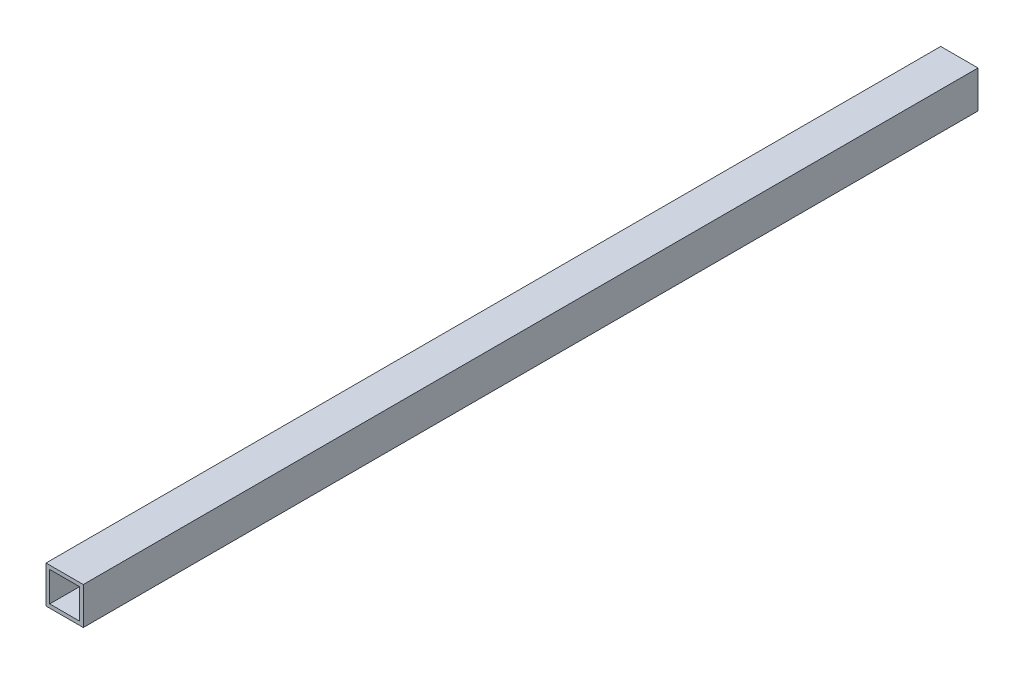
ISO-10303-21;
HEADER;
FILE_DESCRIPTION(('STEP AP214'),'2;1');
FILE_NAME('part.step','',(''),(''),'','','');
FILE_SCHEMA(('AUTOMOTIVE_DESIGN { 1 0 10303 214 1 1 1 1 }'));
ENDSEC;
DATA;
#1=APPLICATION_CONTEXT('core data for automotive mechanical design processes');
#2=APPLICATION_PROTOCOL_DEFINITION('international standard','automotive_design',2000,#1);
#3=PRODUCT_CONTEXT('',#1,'mechanical');
#4=PRODUCT('Part','Part','',(#3));
#5=PRODUCT_RELATED_PRODUCT_CATEGORY('part','',(#4));
#6=PRODUCT_DEFINITION_FORMATION('','',#4);
#7=PRODUCT_DEFINITION_CONTEXT('part definition',#1,'design');
#8=PRODUCT_DEFINITION('design','',#6,#7);
#9=PRODUCT_DEFINITION_SHAPE('','',#8);
#10=(LENGTH_UNIT() NAMED_UNIT(*) SI_UNIT(.MILLI.,.METRE.));
#11=(NAMED_UNIT(*) PLANE_ANGLE_UNIT() SI_UNIT($,.RADIAN.));
#12=(NAMED_UNIT(*) SI_UNIT($,.STERADIAN.) SOLID_ANGLE_UNIT());
#13=UNCERTAINTY_MEASURE_WITH_UNIT(LENGTH_MEASURE(1.E-05),#10,'distance_accuracy_value','');
#14=(GEOMETRIC_REPRESENTATION_CONTEXT(3) GLOBAL_UNCERTAINTY_ASSIGNED_CONTEXT((#13)) GLOBAL_UNIT_ASSIGNED_CONTEXT((#10,
#11,#12)) REPRESENTATION_CONTEXT('',''));
#15=CARTESIAN_POINT('',(0.,0.,0.));
#16=DIRECTION('',(0.,0.,1.));
#17=DIRECTION('',(1.,0.,0.));
#18=AXIS2_PLACEMENT_3D('',#15,#16,#17);
#19=CARTESIAN_POINT('',(0.,0.,480.));
#20=DIRECTION('',(0.,0.,1.));
#21=DIRECTION('',(1.,0.,0.));
#22=AXIS2_PLACEMENT_3D('',#19,#20,#21);
#23=PLANE('',#22);
#24=DIRECTION('',(0.,1.,0.));
#25=VECTOR('',#24,1.);
#26=CARTESIAN_POINT('',(10.,10.,480.));
#27=LINE('',#26,#25);
#28=CARTESIAN_POINT('',(10.,-9.99999999999999,480.));
#29=VERTEX_POINT('',#28);
#30=CARTESIAN_POINT('',(10.,10.,480.));
#31=VERTEX_POINT('',#30);
#32=EDGE_CURVE('E142',#29,#31,#27,.T.);
#33=ORIENTED_EDGE('',*,*,#32,.T.);
#34=DIRECTION('',(-1.,0.,0.));
#35=VECTOR('',#34,1.);
#36=CARTESIAN_POINT('',(-10.,10.,480.));
#37=LINE('',#36,#35);
#38=CARTESIAN_POINT('',(-10.,10.,480.));
#39=VERTEX_POINT('',#38);
#40=EDGE_CURVE('E145',#31,#39,#37,.T.);
#41=ORIENTED_EDGE('',*,*,#40,.T.);
#42=DIRECTION('',(0.,-1.,0.));
#43=VECTOR('',#42,1.);
#44=CARTESIAN_POINT('',(-10.,10.,480.));
#45=LINE('',#44,#43);
#46=CARTESIAN_POINT('',(-10.,-10.,480.));
#47=VERTEX_POINT('',#46);
#48=EDGE_CURVE('E148',#39,#47,#45,.T.);
#49=ORIENTED_EDGE('',*,*,#48,.T.);
#50=DIRECTION('',(1.,0.,0.));
#51=VECTOR('',#50,1.);
#52=CARTESIAN_POINT('',(-10.,-10.,480.));
#53=LINE('',#52,#51);
#54=EDGE_CURVE('E150',#47,#29,#53,.T.);
#55=ORIENTED_EDGE('',*,*,#54,.T.);
#56=EDGE_LOOP('',(#33,#41,#49,#55));
#57=FACE_BOUND('',#56,.T.);
#58=DIRECTION('',(-1.,0.,0.));
#59=VECTOR('',#58,1.);
#60=CARTESIAN_POINT('',(-8.,8.,480.));
#61=LINE('',#60,#59);
#62=CARTESIAN_POINT('',(8.,8.,480.));
#63=VERTEX_POINT('',#62);
#64=CARTESIAN_POINT('',(-8.,8.,480.));
#65=VERTEX_POINT('',#64);
#66=EDGE_CURVE('E114',#63,#65,#61,.T.);
#67=ORIENTED_EDGE('',*,*,#66,.F.);
#68=DIRECTION('',(0.,1.,0.));
#69=VECTOR('',#68,1.);
#70=CARTESIAN_POINT('',(8.,-8.,480.));
#71=LINE('',#70,#69);
#72=CARTESIAN_POINT('',(8.,-8.,480.));
#73=VERTEX_POINT('',#72);
#74=EDGE_CURVE('E106',#73,#63,#71,.T.);
#75=ORIENTED_EDGE('',*,*,#74,.F.);
#76=DIRECTION('',(1.,0.,0.));
#77=VECTOR('',#76,1.);
#78=CARTESIAN_POINT('',(-8.,-8.,480.));
#79=LINE('',#78,#77);
#80=CARTESIAN_POINT('',(-8.,-8.,480.));
#81=VERTEX_POINT('',#80);
#82=EDGE_CURVE('E128',#81,#73,#79,.T.);
#83=ORIENTED_EDGE('',*,*,#82,.F.);
#84=DIRECTION('',(0.,-1.,0.));
#85=VECTOR('',#84,1.);
#86=CARTESIAN_POINT('',(-8.,-8.,480.));
#87=LINE('',#86,#85);
#88=EDGE_CURVE('E126',#65,#81,#87,.T.);
#89=ORIENTED_EDGE('',*,*,#88,.F.);
#90=EDGE_LOOP('',(#67,#75,#83,#89));
#91=FACE_BOUND('',#90,.T.);
#92=ADVANCED_FACE('F41',(#57,#91),#23,.T.);
#93=CARTESIAN_POINT('',(0.,0.,0.));
#94=DIRECTION('',(0.,0.,1.));
#95=DIRECTION('',(1.,0.,0.));
#96=AXIS2_PLACEMENT_3D('',#93,#94,#95);
#97=PLANE('',#96);
#98=DIRECTION('',(0.,1.,0.));
#99=VECTOR('',#98,1.);
#100=CARTESIAN_POINT('',(10.,10.,0.));
#101=LINE('',#100,#99);
#102=CARTESIAN_POINT('',(10.,-9.99999999999999,0.));
#103=VERTEX_POINT('',#102);
#104=CARTESIAN_POINT('',(10.,10.,0.));
#105=VERTEX_POINT('',#104);
#106=EDGE_CURVE('E122',#103,#105,#101,.T.);
#107=ORIENTED_EDGE('',*,*,#106,.F.);
#108=DIRECTION('',(1.,0.,0.));
#109=VECTOR('',#108,1.);
#110=CARTESIAN_POINT('',(-10.,-10.,0.));
#111=LINE('',#110,#109);
#112=CARTESIAN_POINT('',(-10.,-10.,0.));
#113=VERTEX_POINT('',#112);
#114=EDGE_CURVE('E146',#113,#103,#111,.T.);
#115=ORIENTED_EDGE('',*,*,#114,.F.);
#116=DIRECTION('',(0.,-1.,0.));
#117=VECTOR('',#116,1.);
#118=CARTESIAN_POINT('',(-10.,10.,0.));
#119=LINE('',#118,#117);
#120=CARTESIAN_POINT('',(-10.,10.,0.));
#121=VERTEX_POINT('',#120);
#122=EDGE_CURVE('E157',#121,#113,#119,.T.);
#123=ORIENTED_EDGE('',*,*,#122,.F.);
#124=DIRECTION('',(-1.,0.,0.));
#125=VECTOR('',#124,1.);
#126=CARTESIAN_POINT('',(-10.,10.,0.));
#127=LINE('',#126,#125);
#128=EDGE_CURVE('E155',#105,#121,#127,.T.);
#129=ORIENTED_EDGE('',*,*,#128,.F.);
#130=EDGE_LOOP('',(#107,#115,#123,#129));
#131=FACE_BOUND('',#130,.T.);
#132=DIRECTION('',(0.,1.,0.));
#133=VECTOR('',#132,1.);
#134=CARTESIAN_POINT('',(8.,-8.,0.));
#135=LINE('',#134,#133);
#136=CARTESIAN_POINT('',(8.,-8.,0.));
#137=VERTEX_POINT('',#136);
#138=CARTESIAN_POINT('',(8.,8.,0.));
#139=VERTEX_POINT('',#138);
#140=EDGE_CURVE('E64',#137,#139,#135,.T.);
#141=ORIENTED_EDGE('',*,*,#140,.T.);
#142=DIRECTION('',(-1.,0.,0.));
#143=VECTOR('',#142,1.);
#144=CARTESIAN_POINT('',(-8.,8.,0.));
#145=LINE('',#144,#143);
#146=CARTESIAN_POINT('',(-8.,8.,0.));
#147=VERTEX_POINT('',#146);
#148=EDGE_CURVE('E121',#139,#147,#145,.T.);
#149=ORIENTED_EDGE('',*,*,#148,.T.);
#150=DIRECTION('',(0.,-1.,0.));
#151=VECTOR('',#150,1.);
#152=CARTESIAN_POINT('',(-8.,-8.,0.));
#153=LINE('',#152,#151);
#154=CARTESIAN_POINT('',(-8.,-8.,0.));
#155=VERTEX_POINT('',#154);
#156=EDGE_CURVE('E134',#147,#155,#153,.T.);
#157=ORIENTED_EDGE('',*,*,#156,.T.);
#158=DIRECTION('',(1.,0.,0.));
#159=VECTOR('',#158,1.);
#160=CARTESIAN_POINT('',(-8.,-8.,0.));
#161=LINE('',#160,#159);
#162=EDGE_CURVE('E115',#155,#137,#161,.T.);
#163=ORIENTED_EDGE('',*,*,#162,.T.);
#164=EDGE_LOOP('',(#141,#149,#157,#163));
#165=FACE_BOUND('',#164,.T.);
#166=ADVANCED_FACE('F175',(#131,#165),#97,.F.);
#167=CARTESIAN_POINT('',(10.,10.,480.));
#168=DIRECTION('',(-1.,0.,0.));
#169=DIRECTION('',(0.,-1.,0.));
#170=AXIS2_PLACEMENT_3D('',#167,#168,#169);
#171=PLANE('',#170);
#172=ORIENTED_EDGE('',*,*,#106,.T.);
#173=DIRECTION('',(0.,0.,-1.));
#174=VECTOR('',#173,1.);
#175=CARTESIAN_POINT('',(10.,10.,480.));
#176=LINE('',#175,#174);
#177=EDGE_CURVE('E11',#31,#105,#176,.T.);
#178=ORIENTED_EDGE('',*,*,#177,.F.);
#179=ORIENTED_EDGE('',*,*,#32,.F.);
#180=DIRECTION('',(0.,0.,-1.));
#181=VECTOR('',#180,1.);
#182=CARTESIAN_POINT('',(10.,-9.99999999999999,480.));
#183=LINE('',#182,#181);
#184=EDGE_CURVE('E152',#29,#103,#183,.T.);
#185=ORIENTED_EDGE('',*,*,#184,.T.);
#186=EDGE_LOOP('',(#172,#178,#179,#185));
#187=FACE_BOUND('',#186,.T.);
#188=ADVANCED_FACE('F43',(#187),#171,.F.);
#189=CARTESIAN_POINT('',(-10.,10.,480.));
#190=DIRECTION('',(0.,-1.,0.));
#191=DIRECTION('',(0.,0.,-1.));
#192=AXIS2_PLACEMENT_3D('',#189,#190,#191);
#193=PLANE('',#192);
#194=ORIENTED_EDGE('',*,*,#128,.T.);
#195=DIRECTION('',(0.,0.,-1.));
#196=VECTOR('',#195,1.);
#197=CARTESIAN_POINT('',(-10.,10.,480.));
#198=LINE('',#197,#196);
#199=EDGE_CURVE('E49',#39,#121,#198,.T.);
#200=ORIENTED_EDGE('',*,*,#199,.F.);
#201=ORIENTED_EDGE('',*,*,#40,.F.);
#202=ORIENTED_EDGE('',*,*,#177,.T.);
#203=EDGE_LOOP('',(#194,#200,#201,#202));
#204=FACE_BOUND('',#203,.T.);
#205=ADVANCED_FACE('F185',(#204),#193,.F.);
#206=CARTESIAN_POINT('',(-10.,10.,480.));
#207=DIRECTION('',(1.,0.,0.));
#208=DIRECTION('',(0.,1.,0.));
#209=AXIS2_PLACEMENT_3D('',#206,#207,#208);
#210=PLANE('',#209);
#211=ORIENTED_EDGE('',*,*,#122,.T.);
#212=DIRECTION('',(0.,0.,-1.));
#213=VECTOR('',#212,1.);
#214=CARTESIAN_POINT('',(-10.,-10.,480.));
#215=LINE('',#214,#213);
#216=EDGE_CURVE('E162',#47,#113,#215,.T.);
#217=ORIENTED_EDGE('',*,*,#216,.F.);
#218=ORIENTED_EDGE('',*,*,#48,.F.);
#219=ORIENTED_EDGE('',*,*,#199,.T.);
#220=EDGE_LOOP('',(#211,#217,#218,#219));
#221=FACE_BOUND('',#220,.T.);
#222=ADVANCED_FACE('F169',(#221),#210,.F.);
#223=CARTESIAN_POINT('',(-10.,-10.,480.));
#224=DIRECTION('',(0.,1.,0.));
#225=DIRECTION('',(-1.,0.,0.));
#226=AXIS2_PLACEMENT_3D('',#223,#224,#225);
#227=PLANE('',#226);
#228=ORIENTED_EDGE('',*,*,#114,.T.);
#229=ORIENTED_EDGE('',*,*,#184,.F.);
#230=ORIENTED_EDGE('',*,*,#54,.F.);
#231=ORIENTED_EDGE('',*,*,#216,.T.);
#232=EDGE_LOOP('',(#228,#229,#230,#231));
#233=FACE_BOUND('',#232,.T.);
#234=ADVANCED_FACE('F179',(#233),#227,.F.);
#235=CARTESIAN_POINT('',(8.,-8.,480.));
#236=DIRECTION('',(-1.,0.,0.));
#237=DIRECTION('',(0.,0.,1.));
#238=AXIS2_PLACEMENT_3D('',#235,#236,#237);
#239=PLANE('',#238);
#240=ORIENTED_EDGE('',*,*,#140,.F.);
#241=DIRECTION('',(0.,0.,-1.));
#242=VECTOR('',#241,1.);
#243=CARTESIAN_POINT('',(8.,-8.,480.));
#244=LINE('',#243,#242);
#245=EDGE_CURVE('E110',#73,#137,#244,.T.);
#246=ORIENTED_EDGE('',*,*,#245,.F.);
#247=ORIENTED_EDGE('',*,*,#74,.T.);
#248=DIRECTION('',(0.,0.,-1.));
#249=VECTOR('',#248,1.);
#250=CARTESIAN_POINT('',(8.,8.,480.));
#251=LINE('',#250,#249);
#252=EDGE_CURVE('E109',#63,#139,#251,.T.);
#253=ORIENTED_EDGE('',*,*,#252,.T.);
#254=EDGE_LOOP('',(#240,#246,#247,#253));
#255=FACE_BOUND('',#254,.T.);
#256=ADVANCED_FACE('F108',(#255),#239,.T.);
#257=CARTESIAN_POINT('',(-8.,8.,480.));
#258=DIRECTION('',(0.,-1.,0.));
#259=DIRECTION('',(1.,0.,0.));
#260=AXIS2_PLACEMENT_3D('',#257,#258,#259);
#261=PLANE('',#260);
#262=ORIENTED_EDGE('',*,*,#148,.F.);
#263=ORIENTED_EDGE('',*,*,#252,.F.);
#264=ORIENTED_EDGE('',*,*,#66,.T.);
#265=DIRECTION('',(0.,0.,-1.));
#266=VECTOR('',#265,1.);
#267=CARTESIAN_POINT('',(-8.,8.,480.));
#268=LINE('',#267,#266);
#269=EDGE_CURVE('E123',#65,#147,#268,.T.);
#270=ORIENTED_EDGE('',*,*,#269,.T.);
#271=EDGE_LOOP('',(#262,#263,#264,#270));
#272=FACE_BOUND('',#271,.T.);
#273=ADVANCED_FACE('F118',(#272),#261,.T.);
#274=CARTESIAN_POINT('',(-8.,-8.,480.));
#275=DIRECTION('',(1.,0.,0.));
#276=DIRECTION('',(0.,1.,0.));
#277=AXIS2_PLACEMENT_3D('',#274,#275,#276);
#278=PLANE('',#277);
#279=ORIENTED_EDGE('',*,*,#156,.F.);
#280=ORIENTED_EDGE('',*,*,#269,.F.);
#281=ORIENTED_EDGE('',*,*,#88,.T.);
#282=DIRECTION('',(0.,0.,-1.));
#283=VECTOR('',#282,1.);
#284=CARTESIAN_POINT('',(-8.,-8.,480.));
#285=LINE('',#284,#283);
#286=EDGE_CURVE('E56',#81,#155,#285,.T.);
#287=ORIENTED_EDGE('',*,*,#286,.T.);
#288=EDGE_LOOP('',(#279,#280,#281,#287));
#289=FACE_BOUND('',#288,.T.);
#290=ADVANCED_FACE('F208',(#289),#278,.T.);
#291=CARTESIAN_POINT('',(-8.,-8.,480.));
#292=DIRECTION('',(0.,1.,0.));
#293=DIRECTION('',(0.,0.,1.));
#294=AXIS2_PLACEMENT_3D('',#291,#292,#293);
#295=PLANE('',#294);
#296=ORIENTED_EDGE('',*,*,#162,.F.);
#297=ORIENTED_EDGE('',*,*,#286,.F.);
#298=ORIENTED_EDGE('',*,*,#82,.T.);
#299=ORIENTED_EDGE('',*,*,#245,.T.);
#300=EDGE_LOOP('',(#296,#297,#298,#299));
#301=FACE_BOUND('',#300,.T.);
#302=ADVANCED_FACE('F212',(#301),#295,.T.);
#303=CLOSED_SHELL('',(#92,#166,#188,#205,#222,#234,#256,#273,#290,#302));
#304=MANIFOLD_SOLID_BREP('B2',#303);
#305=ADVANCED_BREP_SHAPE_REPRESENTATION('',(#18,#304),#14);
#306=SHAPE_DEFINITION_REPRESENTATION(#9,#305);
ENDSEC;
END-ISO-10303-21;
